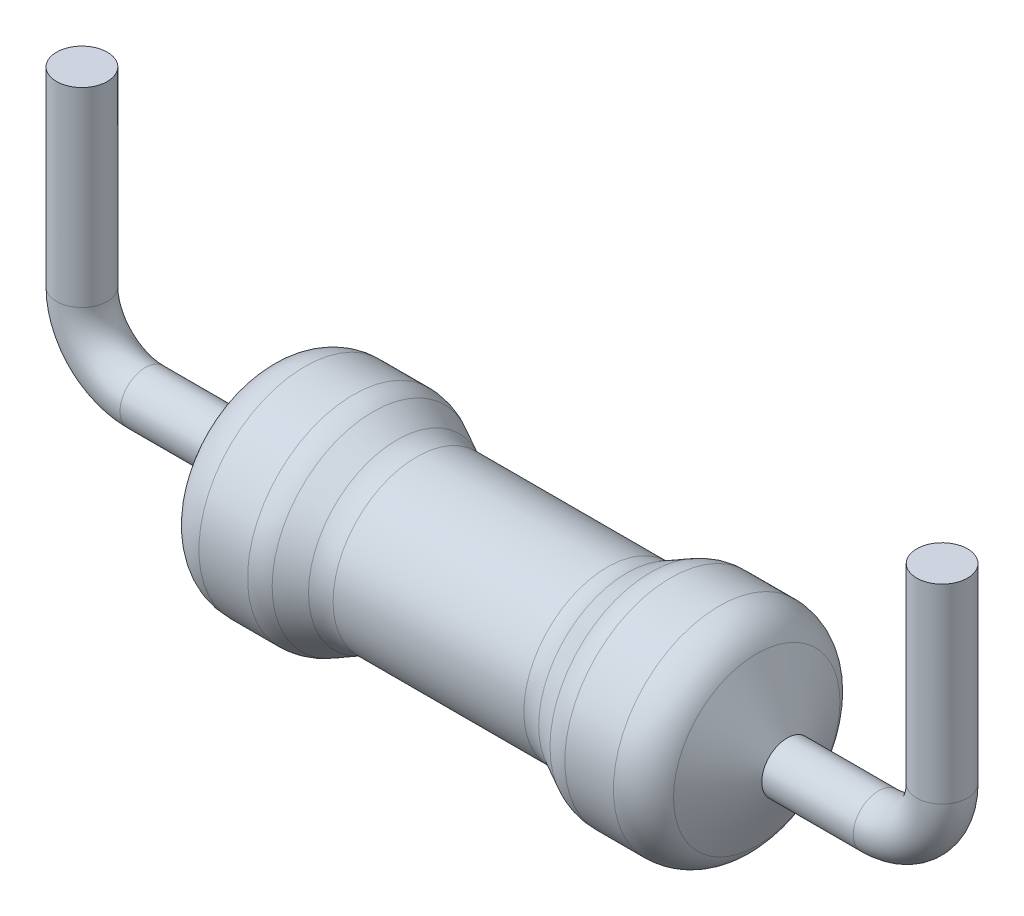
ISO-10303-21;
HEADER;
FILE_DESCRIPTION(('STEP AP214'),'2;1');
FILE_NAME('part.step','',(''),(''),'','','');
FILE_SCHEMA(('AUTOMOTIVE_DESIGN { 1 0 10303 214 1 1 1 1 }'));
ENDSEC;
DATA;
#1=APPLICATION_CONTEXT('core data for automotive mechanical design processes');
#2=APPLICATION_PROTOCOL_DEFINITION('international standard','automotive_design',2000,#1);
#3=PRODUCT_CONTEXT('',#1,'mechanical');
#4=PRODUCT('Part','Part','',(#3));
#5=PRODUCT_RELATED_PRODUCT_CATEGORY('part','',(#4));
#6=PRODUCT_DEFINITION_FORMATION('','',#4);
#7=PRODUCT_DEFINITION_CONTEXT('part definition',#1,'design');
#8=PRODUCT_DEFINITION('design','',#6,#7);
#9=PRODUCT_DEFINITION_SHAPE('','',#8);
#10=(LENGTH_UNIT() NAMED_UNIT(*) SI_UNIT(.MILLI.,.METRE.));
#11=(NAMED_UNIT(*) PLANE_ANGLE_UNIT() SI_UNIT($,.RADIAN.));
#12=(NAMED_UNIT(*) SI_UNIT($,.STERADIAN.) SOLID_ANGLE_UNIT());
#13=UNCERTAINTY_MEASURE_WITH_UNIT(LENGTH_MEASURE(1.E-05),#10,'distance_accuracy_value','');
#14=(GEOMETRIC_REPRESENTATION_CONTEXT(3) GLOBAL_UNCERTAINTY_ASSIGNED_CONTEXT((#13)) GLOBAL_UNIT_ASSIGNED_CONTEXT((#10,
#11,#12)) REPRESENTATION_CONTEXT('',''));
#15=CARTESIAN_POINT('',(0.,0.,0.));
#16=DIRECTION('',(0.,0.,1.));
#17=DIRECTION('',(1.,0.,0.));
#18=AXIS2_PLACEMENT_3D('',#15,#16,#17);
#19=CARTESIAN_POINT('',(3.25,0.,0.));
#20=DIRECTION('',(-1.,0.,0.));
#21=DIRECTION('',(0.,0.,1.));
#22=AXIS2_PLACEMENT_3D('',#19,#20,#21);
#23=CONICAL_SURFACE('',#22,0.3,1.08631839775787);
#24=CARTESIAN_POINT('',(2.89059304399141,0.,0.));
#25=DIRECTION('',(1.,0.,0.));
#26=DIRECTION('',(0.,0.,-1.));
#27=AXIS2_PLACEMENT_3D('',#24,#25,#26);
#28=CIRCLE('',#27,0.982873216416311);
#29=CARTESIAN_POINT('',(2.89059304399141,0.,0.982873216416312));
#30=VERTEX_POINT('',#29);
#31=EDGE_CURVE('E11',#30,#30,#28,.T.);
#32=CARTESIAN_POINT('',(3.25,0.,0.));
#33=DIRECTION('',(-1.,0.,0.));
#34=DIRECTION('',(0.,0.,1.));
#35=AXIS2_PLACEMENT_3D('',#32,#33,#34);
#36=CIRCLE('',#35,0.3);
#37=CARTESIAN_POINT('',(3.25,0.,0.3));
#38=VERTEX_POINT('',#37);
#39=EDGE_CURVE('E61',#38,#38,#36,.T.);
#40=CARTESIAN_POINT('',(2.89059304399141,0.,0.982873216416312));
#41=CARTESIAN_POINT('',(2.89433686644984,0.,0.975759953745308));
#42=CARTESIAN_POINT('',(2.89808068890826,0.,0.968646691074305));
#43=CARTESIAN_POINT('',(2.90556833382511,0.,0.954420165732298));
#44=CARTESIAN_POINT('',(2.90931215628353,0.,0.947306903061295));
#45=CARTESIAN_POINT('',(2.91679980120037,0.,0.933080377719289));
#46=CARTESIAN_POINT('',(2.9205436236588,0.,0.925967115048286));
#47=CARTESIAN_POINT('',(2.92803126857564,0.,0.911740589706279));
#48=CARTESIAN_POINT('',(2.93177509103407,0.,0.904627327035276));
#49=CARTESIAN_POINT('',(2.93926273595091,0.,0.890400801693269));
#50=CARTESIAN_POINT('',(2.94300655840933,0.,0.883287539022266));
#51=CARTESIAN_POINT('',(2.95049420332618,0.,0.869061013680259));
#52=CARTESIAN_POINT('',(2.9542380257846,0.,0.861947751009256));
#53=CARTESIAN_POINT('',(2.96172567070145,0.,0.84772122566725));
#54=CARTESIAN_POINT('',(2.96546949315987,0.,0.840607962996247));
#55=CARTESIAN_POINT('',(2.97295713807672,0.,0.82638143765424));
#56=CARTESIAN_POINT('',(2.97670096053514,0.,0.819268174983237));
#57=CARTESIAN_POINT('',(2.98418860545198,0.,0.80504164964123));
#58=CARTESIAN_POINT('',(2.98793242791041,0.,0.797928386970227));
#59=CARTESIAN_POINT('',(2.99542007282725,0.,0.783701861628221));
#60=CARTESIAN_POINT('',(2.99916389528568,0.,0.776588598957217));
#61=CARTESIAN_POINT('',(3.00665154020252,0.,0.762362073615211));
#62=CARTESIAN_POINT('',(3.01039536266094,0.,0.755248810944208));
#63=CARTESIAN_POINT('',(3.01788300757779,0.,0.741022285602201));
#64=CARTESIAN_POINT('',(3.02162683003621,0.,0.733909022931198));
#65=CARTESIAN_POINT('',(3.02911447495306,0.,0.719682497589191));
#66=CARTESIAN_POINT('',(3.03285829741148,0.,0.712569234918188));
#67=CARTESIAN_POINT('',(3.04034594232833,0.,0.698342709576182));
#68=CARTESIAN_POINT('',(3.04408976478675,0.,0.691229446905178));
#69=CARTESIAN_POINT('',(3.05157740970359,0.,0.677002921563172));
#70=CARTESIAN_POINT('',(3.05532123216202,0.,0.669889658892168));
#71=CARTESIAN_POINT('',(3.06280887707886,0.,0.655663133550162));
#72=CARTESIAN_POINT('',(3.06655269953728,0.,0.648549870879159));
#73=CARTESIAN_POINT('',(3.07404034445413,0.,0.634323345537152));
#74=CARTESIAN_POINT('',(3.07778416691255,0.,0.627210082866149));
#75=CARTESIAN_POINT('',(3.0852718118294,0.,0.612983557524142));
#76=CARTESIAN_POINT('',(3.08901563428782,0.,0.605870294853139));
#77=CARTESIAN_POINT('',(3.09650327920467,0.,0.591643769511133));
#78=CARTESIAN_POINT('',(3.10024710166309,0.,0.58453050684013));
#79=CARTESIAN_POINT('',(3.10773474657993,0.,0.570303981498123));
#80=CARTESIAN_POINT('',(3.11147856903836,0.,0.56319071882712));
#81=CARTESIAN_POINT('',(3.1189662139552,0.,0.548964193485113));
#82=CARTESIAN_POINT('',(3.12271003641363,0.,0.54185093081411));
#83=CARTESIAN_POINT('',(3.13019768133047,0.,0.527624405472104));
#84=CARTESIAN_POINT('',(3.13394150378889,0.,0.5205111428011));
#85=CARTESIAN_POINT('',(3.14142914870574,0.,0.506284617459094));
#86=CARTESIAN_POINT('',(3.14517297116416,0.,0.49917135478809));
#87=CARTESIAN_POINT('',(3.15266061608101,0.,0.484944829446084));
#88=CARTESIAN_POINT('',(3.15640443853943,0.,0.477831566775081));
#89=CARTESIAN_POINT('',(3.16389208345628,0.,0.463605041433074));
#90=CARTESIAN_POINT('',(3.1676359059147,0.,0.456491778762071));
#91=CARTESIAN_POINT('',(3.17512355083154,0.,0.442265253420065));
#92=CARTESIAN_POINT('',(3.17886737328997,0.,0.435151990749061));
#93=CARTESIAN_POINT('',(3.18635501820681,0.,0.420925465407055));
#94=CARTESIAN_POINT('',(3.19009884066524,0.,0.413812202736052));
#95=CARTESIAN_POINT('',(3.19758648558208,0.,0.399585677394045));
#96=CARTESIAN_POINT('',(3.2013303080405,0.,0.392472414723042));
#97=CARTESIAN_POINT('',(3.20881795295735,0.,0.378245889381035));
#98=CARTESIAN_POINT('',(3.21256177541577,0.,0.371132626710032));
#99=CARTESIAN_POINT('',(3.22004942033262,0.,0.356906101368026));
#100=CARTESIAN_POINT('',(3.22379324279104,0.,0.349792838697022));
#101=CARTESIAN_POINT('',(3.23128088770789,0.,0.335566313355016));
#102=CARTESIAN_POINT('',(3.23502471016631,0.,0.328453050684013));
#103=CARTESIAN_POINT('',(3.24251235508315,0.,0.314226525342006));
#104=CARTESIAN_POINT('',(3.24625617754158,0.,0.307113262671003));
#105=CARTESIAN_POINT('',(3.25,0.,0.3));
#106=B_SPLINE_CURVE_WITH_KNOTS('',3,(#40,#41,#42,#43,#44,#45,#46,#47,#48,#49,#50,#51,#52,#53,
#54,#55,#56,#57,#58,#59,#60,#61,#62,#63,#64,#65,#66,#67,#68,#69,#70,#71,#72,#73,#74,#75,#76,#77,
#78,#79,#80,#81,#82,#83,#84,#85,#86,#87,#88,#89,#90,#91,#92,#93,#94,#95,#96,#97,#98,#99,#100,
#101,#102,#103,#104,#105),.UNSPECIFIED.,.F.,.F.,(4,2,2,2,2,2,2,2,2,2,2,2,2,2,2,2,2,2,2,2,2,2,2,
2,2,2,2,2,2,2,2,2,4),(0.,0.024114983139988,0.0482299662799762,0.0723449494199642,
0.0964599325599524,0.12057491569994,0.144689898839929,0.168804881979917,0.192919865119905,
0.217034848259893,0.241149831399881,0.265264814539869,0.289379797679857,0.313494780819845,
0.337609763959833,0.361724747099821,0.385839730239809,0.409954713379797,0.434069696519786,
0.458184679659774,0.482299662799762,0.50641464593975,0.530529629079738,0.554644612219726,
0.578759595359714,0.602874578499702,0.62698956163969,0.651104544779678,0.675219527919667,
0.699334511059655,0.723449494199643,0.747564477339631,0.771679460479619),.UNSPECIFIED.);
#107=EDGE_CURVE('BSEAM39',#30,#38,#106,.T.);
#108=ORIENTED_EDGE('',*,*,#31,.T.);
#109=ORIENTED_EDGE('',*,*,#39,.T.);
#110=ORIENTED_EDGE('',*,*,#107,.T.);
#111=ORIENTED_EDGE('',*,*,#107,.F.);
#112=EDGE_LOOP('',(#108,#110,#109,#111));
#113=FACE_BOUND('',#112,.T.);
#114=ADVANCED_FACE('F39',(#113),#23,.T.);
#115=CARTESIAN_POINT('',(0.,0.,0.));
#116=DIRECTION('',(-1.,0.,0.));
#117=DIRECTION('',(0.,0.,1.));
#118=AXIS2_PLACEMENT_3D('',#115,#116,#117);
#119=CYLINDRICAL_SURFACE('',#118,1.25);
#120=CARTESIAN_POINT('',(1.87354552767919,0.,0.));
#121=DIRECTION('',(1.,0.,0.));
#122=DIRECTION('',(0.,0.,-1.));
#123=AXIS2_PLACEMENT_3D('',#120,#121,#122);
#124=CIRCLE('',#123,1.25);
#125=CARTESIAN_POINT('',(1.87354552767919,0.,-1.25));
#126=VERTEX_POINT('',#125);
#127=EDGE_CURVE('E48',#126,#126,#124,.T.);
#128=ORIENTED_EDGE('',*,*,#127,.T.);
#129=EDGE_LOOP('',(#128));
#130=FACE_BOUND('',#129,.T.);
#131=CARTESIAN_POINT('',(2.44813393280042,0.,0.));
#132=DIRECTION('',(1.,0.,0.));
#133=DIRECTION('',(0.,0.,-1.));
#134=AXIS2_PLACEMENT_3D('',#131,#132,#133);
#135=CIRCLE('',#134,1.25);
#136=CARTESIAN_POINT('',(2.44813393280042,0.,-1.25));
#137=VERTEX_POINT('',#136);
#138=EDGE_CURVE('E113',#137,#137,#135,.F.);
#139=ORIENTED_EDGE('',*,*,#138,.T.);
#140=EDGE_LOOP('',(#139));
#141=FACE_BOUND('',#140,.T.);
#142=ADVANCED_FACE('F120',(#130,#141),#119,.T.);
#143=CARTESIAN_POINT('',(1.75,0.,0.));
#144=DIRECTION('',(1.,0.,0.));
#145=DIRECTION('',(0.,0.,-1.));
#146=AXIS2_PLACEMENT_3D('',#143,#144,#145);
#147=CONICAL_SURFACE('',#146,1.25,0.484477929037023);
#148=CARTESIAN_POINT('',(1.35932768873712,0.,0.));
#149=DIRECTION('',(1.,0.,0.));
#150=DIRECTION('',(0.,0.,-1.));
#151=AXIS2_PLACEMENT_3D('',#148,#149,#150);
#152=CIRCLE('',#151,1.04438299407217);
#153=CARTESIAN_POINT('',(1.35932768873712,0.,-1.04438299407217));
#154=VERTEX_POINT('',#153);
#155=EDGE_CURVE('E109',#154,#154,#152,.T.);
#156=ORIENTED_EDGE('',*,*,#155,.T.);
#157=EDGE_LOOP('',(#156));
#158=FACE_BOUND('',#157,.T.);
#159=CARTESIAN_POINT('',(1.64067231126288,0.,0.));
#160=DIRECTION('',(-1.,0.,0.));
#161=DIRECTION('',(0.,0.,1.));
#162=AXIS2_PLACEMENT_3D('',#159,#160,#161);
#163=CIRCLE('',#162,1.19245911119099);
#164=CARTESIAN_POINT('',(1.64067231126288,0.,1.19245911119099));
#165=VERTEX_POINT('',#164);
#166=EDGE_CURVE('E105',#165,#165,#163,.T.);
#167=ORIENTED_EDGE('',*,*,#166,.T.);
#168=EDGE_LOOP('',(#167));
#169=FACE_BOUND('',#168,.T.);
#170=ADVANCED_FACE('F129',(#158,#169),#147,.T.);
#171=CARTESIAN_POINT('',(0.,0.,0.));
#172=DIRECTION('',(-1.,0.,0.));
#173=DIRECTION('',(0.,0.,1.));
#174=AXIS2_PLACEMENT_3D('',#171,#172,#173);
#175=CYLINDRICAL_SURFACE('',#174,0.986842105263158);
#176=CARTESIAN_POINT('',(-1.12645447232081,0.,0.));
#177=DIRECTION('',(-1.,0.,0.));
#178=DIRECTION('',(0.,0.,1.));
#179=AXIS2_PLACEMENT_3D('',#176,#177,#178);
#180=CIRCLE('',#179,0.986842105263158);
#181=CARTESIAN_POINT('',(-1.12645447232081,0.,0.986842105263158));
#182=VERTEX_POINT('',#181);
#183=EDGE_CURVE('E101',#182,#182,#180,.F.);
#184=ORIENTED_EDGE('',*,*,#183,.T.);
#185=EDGE_LOOP('',(#184));
#186=FACE_BOUND('',#185,.T.);
#187=CARTESIAN_POINT('',(1.12645447232081,0.,0.));
#188=DIRECTION('',(-1.,0.,0.));
#189=DIRECTION('',(0.,0.,1.));
#190=AXIS2_PLACEMENT_3D('',#187,#188,#189);
#191=CIRCLE('',#190,0.986842105263158);
#192=CARTESIAN_POINT('',(1.12645447232081,0.,0.986842105263158));
#193=VERTEX_POINT('',#192);
#194=EDGE_CURVE('E97',#193,#193,#191,.T.);
#195=ORIENTED_EDGE('',*,*,#194,.T.);
#196=EDGE_LOOP('',(#195));
#197=FACE_BOUND('',#196,.T.);
#198=ADVANCED_FACE('F131',(#186,#197),#175,.T.);
#199=CARTESIAN_POINT('',(-1.25,0.,0.));
#200=DIRECTION('',(-1.,0.,0.));
#201=DIRECTION('',(0.,0.,1.));
#202=AXIS2_PLACEMENT_3D('',#199,#200,#201);
#203=CONICAL_SURFACE('',#202,0.986842105263158,0.484477929037023);
#204=CARTESIAN_POINT('',(-1.64067231126288,0.,0.));
#205=DIRECTION('',(1.,0.,0.));
#206=DIRECTION('',(0.,0.,-1.));
#207=AXIS2_PLACEMENT_3D('',#204,#205,#206);
#208=CIRCLE('',#207,1.19245911119099);
#209=CARTESIAN_POINT('',(-1.64067231126288,0.,-1.19245911119099));
#210=VERTEX_POINT('',#209);
#211=EDGE_CURVE('E93',#210,#210,#208,.T.);
#212=ORIENTED_EDGE('',*,*,#211,.T.);
#213=EDGE_LOOP('',(#212));
#214=FACE_BOUND('',#213,.T.);
#215=CARTESIAN_POINT('',(-1.35932768873712,0.,0.));
#216=DIRECTION('',(-1.,0.,0.));
#217=DIRECTION('',(0.,0.,1.));
#218=AXIS2_PLACEMENT_3D('',#215,#216,#217);
#219=CIRCLE('',#218,1.04438299407217);
#220=CARTESIAN_POINT('',(-1.35932768873712,0.,1.04438299407217));
#221=VERTEX_POINT('',#220);
#222=EDGE_CURVE('E89',#221,#221,#219,.T.);
#223=ORIENTED_EDGE('',*,*,#222,.T.);
#224=EDGE_LOOP('',(#223));
#225=FACE_BOUND('',#224,.T.);
#226=ADVANCED_FACE('F138',(#214,#225),#203,.T.);
#227=CARTESIAN_POINT('',(0.,0.,0.));
#228=DIRECTION('',(-1.,0.,0.));
#229=DIRECTION('',(0.,0.,1.));
#230=AXIS2_PLACEMENT_3D('',#227,#228,#229);
#231=CYLINDRICAL_SURFACE('',#230,1.25);
#232=CARTESIAN_POINT('',(-2.44813393280042,0.,0.));
#233=DIRECTION('',(1.,0.,0.));
#234=DIRECTION('',(0.,0.,-1.));
#235=AXIS2_PLACEMENT_3D('',#232,#233,#234);
#236=CIRCLE('',#235,1.25);
#237=CARTESIAN_POINT('',(-2.44813393280042,0.,-1.25));
#238=VERTEX_POINT('',#237);
#239=EDGE_CURVE('E85',#238,#238,#236,.T.);
#240=ORIENTED_EDGE('',*,*,#239,.T.);
#241=EDGE_LOOP('',(#240));
#242=FACE_BOUND('',#241,.T.);
#243=CARTESIAN_POINT('',(-1.87354552767919,0.,0.));
#244=DIRECTION('',(1.,0.,0.));
#245=DIRECTION('',(0.,0.,-1.));
#246=AXIS2_PLACEMENT_3D('',#243,#244,#245);
#247=CIRCLE('',#246,1.25);
#248=CARTESIAN_POINT('',(-1.87354552767919,0.,-1.25));
#249=VERTEX_POINT('',#248);
#250=EDGE_CURVE('E81',#249,#249,#247,.F.);
#251=ORIENTED_EDGE('',*,*,#250,.T.);
#252=EDGE_LOOP('',(#251));
#253=FACE_BOUND('',#252,.T.);
#254=ADVANCED_FACE('F285',(#242,#253),#231,.T.);
#255=CARTESIAN_POINT('',(-2.75,0.,0.));
#256=DIRECTION('',(1.,0.,0.));
#257=DIRECTION('',(0.,0.,-1.));
#258=AXIS2_PLACEMENT_3D('',#255,#256,#257);
#259=CONICAL_SURFACE('',#258,1.25,1.08631839775787);
#260=CARTESIAN_POINT('',(-2.89059304399141,0.,0.));
#261=DIRECTION('',(-1.,0.,0.));
#262=DIRECTION('',(0.,0.,1.));
#263=AXIS2_PLACEMENT_3D('',#260,#261,#262);
#264=CIRCLE('',#263,0.982873216416311);
#265=CARTESIAN_POINT('',(-2.89059304399141,0.,-0.982873216416312));
#266=VERTEX_POINT('',#265);
#267=EDGE_CURVE('E77',#266,#266,#264,.T.);
#268=CARTESIAN_POINT('',(-3.25,0.,0.));
#269=DIRECTION('',(-1.,0.,0.));
#270=DIRECTION('',(0.,0.,1.));
#271=AXIS2_PLACEMENT_3D('',#268,#269,#270);
#272=CIRCLE('',#271,0.3);
#273=CARTESIAN_POINT('',(-3.25,0.,-0.3));
#274=VERTEX_POINT('',#273);
#275=EDGE_CURVE('E67',#274,#274,#272,.T.);
#276=CARTESIAN_POINT('',(-2.89059304399141,0.,-0.982873216416312));
#277=CARTESIAN_POINT('',(-2.89433686644984,0.,-0.975759953745309));
#278=CARTESIAN_POINT('',(-2.89808068890826,0.,-0.968646691074305));
#279=CARTESIAN_POINT('',(-2.90556833382511,0.,-0.954420165732299));
#280=CARTESIAN_POINT('',(-2.90931215628353,0.,-0.947306903061295));
#281=CARTESIAN_POINT('',(-2.91679980120037,0.,-0.933080377719289));
#282=CARTESIAN_POINT('',(-2.9205436236588,0.,-0.925967115048286));
#283=CARTESIAN_POINT('',(-2.92803126857564,0.,-0.911740589706279));
#284=CARTESIAN_POINT('',(-2.93177509103407,0.,-0.904627327035276));
#285=CARTESIAN_POINT('',(-2.93926273595091,0.,-0.890400801693269));
#286=CARTESIAN_POINT('',(-2.94300655840933,0.,-0.883287539022266));
#287=CARTESIAN_POINT('',(-2.95049420332618,0.,-0.86906101368026));
#288=CARTESIAN_POINT('',(-2.9542380257846,0.,-0.861947751009256));
#289=CARTESIAN_POINT('',(-2.96172567070145,0.,-0.84772122566725));
#290=CARTESIAN_POINT('',(-2.96546949315987,0.,-0.840607962996247));
#291=CARTESIAN_POINT('',(-2.97295713807672,0.,-0.82638143765424));
#292=CARTESIAN_POINT('',(-2.97670096053514,0.,-0.819268174983237));
#293=CARTESIAN_POINT('',(-2.98418860545198,0.,-0.805041649641231));
#294=CARTESIAN_POINT('',(-2.98793242791041,0.,-0.797928386970227));
#295=CARTESIAN_POINT('',(-2.99542007282725,0.,-0.783701861628221));
#296=CARTESIAN_POINT('',(-2.99916389528568,0.,-0.776588598957218));
#297=CARTESIAN_POINT('',(-3.00665154020252,0.,-0.762362073615211));
#298=CARTESIAN_POINT('',(-3.01039536266094,0.,-0.755248810944208));
#299=CARTESIAN_POINT('',(-3.01788300757779,0.,-0.741022285602201));
#300=CARTESIAN_POINT('',(-3.02162683003621,0.,-0.733909022931198));
#301=CARTESIAN_POINT('',(-3.02911447495306,0.,-0.719682497589192));
#302=CARTESIAN_POINT('',(-3.03285829741148,0.,-0.712569234918188));
#303=CARTESIAN_POINT('',(-3.04034594232833,0.,-0.698342709576182));
#304=CARTESIAN_POINT('',(-3.04408976478675,0.,-0.691229446905179));
#305=CARTESIAN_POINT('',(-3.05157740970359,0.,-0.677002921563172));
#306=CARTESIAN_POINT('',(-3.05532123216202,0.,-0.669889658892169));
#307=CARTESIAN_POINT('',(-3.06280887707886,0.,-0.655663133550162));
#308=CARTESIAN_POINT('',(-3.06655269953728,0.,-0.648549870879159));
#309=CARTESIAN_POINT('',(-3.07404034445413,0.,-0.634323345537153));
#310=CARTESIAN_POINT('',(-3.07778416691255,0.,-0.627210082866149));
#311=CARTESIAN_POINT('',(-3.0852718118294,0.,-0.612983557524143));
#312=CARTESIAN_POINT('',(-3.08901563428782,0.,-0.60587029485314));
#313=CARTESIAN_POINT('',(-3.09650327920467,0.,-0.591643769511133));
#314=CARTESIAN_POINT('',(-3.10024710166309,0.,-0.58453050684013));
#315=CARTESIAN_POINT('',(-3.10773474657993,0.,-0.570303981498123));
#316=CARTESIAN_POINT('',(-3.11147856903836,0.,-0.56319071882712));
#317=CARTESIAN_POINT('',(-3.1189662139552,0.,-0.548964193485114));
#318=CARTESIAN_POINT('',(-3.12271003641363,0.,-0.54185093081411));
#319=CARTESIAN_POINT('',(-3.13019768133047,0.,-0.527624405472104));
#320=CARTESIAN_POINT('',(-3.13394150378889,0.,-0.520511142801101));
#321=CARTESIAN_POINT('',(-3.14142914870574,0.,-0.506284617459094));
#322=CARTESIAN_POINT('',(-3.14517297116416,0.,-0.499171354788091));
#323=CARTESIAN_POINT('',(-3.15266061608101,0.,-0.484944829446084));
#324=CARTESIAN_POINT('',(-3.15640443853943,0.,-0.477831566775081));
#325=CARTESIAN_POINT('',(-3.16389208345628,0.,-0.463605041433075));
#326=CARTESIAN_POINT('',(-3.1676359059147,0.,-0.456491778762072));
#327=CARTESIAN_POINT('',(-3.17512355083154,0.,-0.442265253420065));
#328=CARTESIAN_POINT('',(-3.17886737328997,0.,-0.435151990749062));
#329=CARTESIAN_POINT('',(-3.18635501820681,0.,-0.420925465407055));
#330=CARTESIAN_POINT('',(-3.19009884066524,0.,-0.413812202736052));
#331=CARTESIAN_POINT('',(-3.19758648558208,0.,-0.399585677394046));
#332=CARTESIAN_POINT('',(-3.2013303080405,0.,-0.392472414723042));
#333=CARTESIAN_POINT('',(-3.20881795295735,0.,-0.378245889381036));
#334=CARTESIAN_POINT('',(-3.21256177541577,0.,-0.371132626710033));
#335=CARTESIAN_POINT('',(-3.22004942033262,0.,-0.356906101368026));
#336=CARTESIAN_POINT('',(-3.22379324279104,0.,-0.349792838697023));
#337=CARTESIAN_POINT('',(-3.23128088770789,0.,-0.335566313355016));
#338=CARTESIAN_POINT('',(-3.23502471016631,0.,-0.328453050684013));
#339=CARTESIAN_POINT('',(-3.24251235508315,0.,-0.314226525342007));
#340=CARTESIAN_POINT('',(-3.24625617754158,0.,-0.307113262671003));
#341=CARTESIAN_POINT('',(-3.25,0.,-0.3));
#342=B_SPLINE_CURVE_WITH_KNOTS('',3,(#276,#277,#278,#279,#280,#281,#282,#283,#284,#285,#286,
#287,#288,#289,#290,#291,#292,#293,#294,#295,#296,#297,#298,#299,#300,#301,#302,#303,#304,#305,
#306,#307,#308,#309,#310,#311,#312,#313,#314,#315,#316,#317,#318,#319,#320,#321,#322,#323,#324,
#325,#326,#327,#328,#329,#330,#331,#332,#333,#334,#335,#336,#337,#338,#339,#340,#341),
.UNSPECIFIED.,.F.,.F.,(4,2,2,2,2,2,2,2,2,2,2,2,2,2,2,2,2,2,2,2,2,2,2,2,2,2,2,2,2,2,2,2,4),(0.,
0.0241149831399881,0.0482299662799762,0.0723449494199643,0.0964599325599524,0.12057491569994,
0.144689898839929,0.168804881979917,0.192919865119905,0.217034848259893,0.241149831399881,
0.265264814539869,0.289379797679857,0.313494780819845,0.337609763959833,0.361724747099821,
0.385839730239809,0.409954713379797,0.434069696519785,0.458184679659774,0.482299662799762,
0.50641464593975,0.530529629079738,0.554644612219726,0.578759595359714,0.602874578499702,
0.62698956163969,0.651104544779678,0.675219527919667,0.699334511059655,0.723449494199643,
0.747564477339631,0.771679460479619),.UNSPECIFIED.);
#343=EDGE_CURVE('BSEAM153',#266,#274,#342,.T.);
#344=ORIENTED_EDGE('',*,*,#267,.T.);
#345=ORIENTED_EDGE('',*,*,#275,.F.);
#346=ORIENTED_EDGE('',*,*,#343,.T.);
#347=ORIENTED_EDGE('',*,*,#343,.F.);
#348=EDGE_LOOP('',(#344,#346,#345,#347));
#349=FACE_BOUND('',#348,.T.);
#350=ADVANCED_FACE('F153',(#349),#259,.T.);
#351=CARTESIAN_POINT('',(-2.44813393280042,0.,0.));
#352=DIRECTION('',(1.,0.,0.));
#353=DIRECTION('',(0.,0.,-1.));
#354=AXIS2_PLACEMENT_3D('',#351,#352,#353);
#355=TOROIDAL_SURFACE('',#354,0.75,0.5);
#356=ORIENTED_EDGE('',*,*,#239,.F.);
#357=EDGE_LOOP('',(#356));
#358=FACE_BOUND('',#357,.T.);
#359=ORIENTED_EDGE('',*,*,#267,.F.);
#360=EDGE_LOOP('',(#359));
#361=FACE_BOUND('',#360,.T.);
#362=ADVANCED_FACE('F149',(#358,#361),#355,.T.);
#363=CARTESIAN_POINT('',(-1.87354552767919,0.,0.));
#364=DIRECTION('',(1.,0.,0.));
#365=DIRECTION('',(0.,0.,-1.));
#366=AXIS2_PLACEMENT_3D('',#363,#364,#365);
#367=TOROIDAL_SURFACE('',#366,0.75,0.5);
#368=ORIENTED_EDGE('',*,*,#211,.F.);
#369=EDGE_LOOP('',(#368));
#370=FACE_BOUND('',#369,.T.);
#371=ORIENTED_EDGE('',*,*,#250,.F.);
#372=EDGE_LOOP('',(#371));
#373=FACE_BOUND('',#372,.T.);
#374=ADVANCED_FACE('F152',(#370,#373),#367,.T.);
#375=CARTESIAN_POINT('',(-1.12645447232081,0.,0.));
#376=DIRECTION('',(-1.,0.,0.));
#377=DIRECTION('',(0.,0.,1.));
#378=AXIS2_PLACEMENT_3D('',#375,#376,#377);
#379=TOROIDAL_SURFACE('',#378,1.48684210526316,0.5);
#380=ORIENTED_EDGE('',*,*,#183,.F.);
#381=EDGE_LOOP('',(#380));
#382=FACE_BOUND('',#381,.T.);
#383=ORIENTED_EDGE('',*,*,#222,.F.);
#384=EDGE_LOOP('',(#383));
#385=FACE_BOUND('',#384,.T.);
#386=ADVANCED_FACE('F157',(#382,#385),#379,.F.);
#387=CARTESIAN_POINT('',(1.12645447232081,0.,0.));
#388=DIRECTION('',(-1.,0.,0.));
#389=DIRECTION('',(0.,0.,1.));
#390=AXIS2_PLACEMENT_3D('',#387,#388,#389);
#391=TOROIDAL_SURFACE('',#390,1.48684210526316,0.5);
#392=ORIENTED_EDGE('',*,*,#155,.F.);
#393=EDGE_LOOP('',(#392));
#394=FACE_BOUND('',#393,.T.);
#395=ORIENTED_EDGE('',*,*,#194,.F.);
#396=EDGE_LOOP('',(#395));
#397=FACE_BOUND('',#396,.T.);
#398=ADVANCED_FACE('F126',(#394,#397),#391,.F.);
#399=CARTESIAN_POINT('',(1.87354552767919,0.,0.));
#400=DIRECTION('',(1.,0.,0.));
#401=DIRECTION('',(0.,0.,-1.));
#402=AXIS2_PLACEMENT_3D('',#399,#400,#401);
#403=TOROIDAL_SURFACE('',#402,0.75,0.5);
#404=ORIENTED_EDGE('',*,*,#127,.F.);
#405=EDGE_LOOP('',(#404));
#406=FACE_BOUND('',#405,.T.);
#407=ORIENTED_EDGE('',*,*,#166,.F.);
#408=EDGE_LOOP('',(#407));
#409=FACE_BOUND('',#408,.T.);
#410=ADVANCED_FACE('F123',(#406,#409),#403,.T.);
#411=CARTESIAN_POINT('',(2.44813393280042,0.,0.));
#412=DIRECTION('',(1.,0.,0.));
#413=DIRECTION('',(0.,0.,-1.));
#414=AXIS2_PLACEMENT_3D('',#411,#412,#413);
#415=TOROIDAL_SURFACE('',#414,0.75,0.5);
#416=ORIENTED_EDGE('',*,*,#31,.F.);
#417=EDGE_LOOP('',(#416));
#418=FACE_BOUND('',#417,.T.);
#419=ORIENTED_EDGE('',*,*,#138,.F.);
#420=EDGE_LOOP('',(#419));
#421=FACE_BOUND('',#420,.T.);
#422=ADVANCED_FACE('F41',(#418,#421),#415,.T.);
#423=CARTESIAN_POINT('',(-5.08,3.,0.));
#424=DIRECTION('',(0.,-1.,0.));
#425=DIRECTION('',(0.,0.,-1.));
#426=AXIS2_PLACEMENT_3D('',#423,#424,#425);
#427=PLANE('',#426);
#428=CARTESIAN_POINT('',(-5.08,3.,0.));
#429=DIRECTION('',(0.,-1.,0.));
#430=DIRECTION('',(0.,0.,-1.));
#431=AXIS2_PLACEMENT_3D('',#428,#429,#430);
#432=CIRCLE('',#431,0.3);
#433=CARTESIAN_POINT('',(-5.08,3.,-0.3));
#434=VERTEX_POINT('',#433);
#435=EDGE_CURVE('E53',#434,#434,#432,.T.);
#436=ORIENTED_EDGE('',*,*,#435,.F.);
#437=EDGE_LOOP('',(#436));
#438=FACE_BOUND('',#437,.T.);
#439=ADVANCED_FACE('F182',(#438),#427,.F.);
#440=CARTESIAN_POINT('',(-5.08,3.,0.));
#441=DIRECTION('',(0.,-1.,0.));
#442=DIRECTION('',(0.,0.,-1.));
#443=AXIS2_PLACEMENT_3D('',#440,#441,#442);
#444=CYLINDRICAL_SURFACE('',#443,0.3);
#445=CARTESIAN_POINT('',(-5.08,0.75,0.));
#446=DIRECTION('',(0.,-1.,0.));
#447=DIRECTION('',(0.,0.,-1.));
#448=AXIS2_PLACEMENT_3D('',#445,#446,#447);
#449=CIRCLE('',#448,0.3);
#450=CARTESIAN_POINT('',(-5.38,0.75,0.));
#451=VERTEX_POINT('',#450);
#452=EDGE_CURVE('E351',#451,#451,#449,.T.);
#453=ORIENTED_EDGE('',*,*,#452,.F.);
#454=EDGE_LOOP('',(#453));
#455=FACE_BOUND('',#454,.T.);
#456=ORIENTED_EDGE('',*,*,#435,.T.);
#457=EDGE_LOOP('',(#456));
#458=FACE_BOUND('',#457,.T.);
#459=ADVANCED_FACE('F189',(#455,#458),#444,.T.);
#460=CARTESIAN_POINT('',(-4.33,0.749999999999999,0.));
#461=DIRECTION('',(0.,0.,1.));
#462=DIRECTION('',(1.,0.,0.));
#463=AXIS2_PLACEMENT_3D('',#460,#461,#462);
#464=TOROIDAL_SURFACE('',#463,0.75,0.3);
#465=CARTESIAN_POINT('',(-4.33,0.,0.));
#466=DIRECTION('',(1.,0.,0.));
#467=DIRECTION('',(0.,0.,-1.));
#468=AXIS2_PLACEMENT_3D('',#465,#466,#467);
#469=CIRCLE('',#468,0.3);
#470=CARTESIAN_POINT('',(-4.33,-0.300000000000001,0.));
#471=VERTEX_POINT('',#470);
#472=EDGE_CURVE('E348',#471,#471,#469,.T.);
#473=CARTESIAN_POINT('',(-4.33,0.749999999999999,0.));
#474=DIRECTION('',(0.,0.,1.));
#475=DIRECTION('',(1.,0.,0.));
#476=AXIS2_PLACEMENT_3D('',#473,#474,#475);
#477=CIRCLE('',#476,1.05);
#478=EDGE_CURVE('',#451,#471,#477,.T.);
#479=ORIENTED_EDGE('',*,*,#452,.T.);
#480=ORIENTED_EDGE('',*,*,#472,.F.);
#481=ORIENTED_EDGE('',*,*,#478,.T.);
#482=ORIENTED_EDGE('',*,*,#478,.F.);
#483=EDGE_LOOP('',(#479,#481,#480,#482));
#484=FACE_BOUND('',#483,.T.);
#485=ADVANCED_FACE('F196',(#484),#464,.T.);
#486=CARTESIAN_POINT('',(-4.33,0.,0.));
#487=DIRECTION('',(1.,0.,0.));
#488=DIRECTION('',(0.,1.,0.));
#489=AXIS2_PLACEMENT_3D('',#486,#487,#488);
#490=CYLINDRICAL_SURFACE('',#489,0.3);
#491=ORIENTED_EDGE('',*,*,#472,.T.);
#492=EDGE_LOOP('',(#491));
#493=FACE_BOUND('',#492,.T.);
#494=ORIENTED_EDGE('',*,*,#275,.T.);
#495=EDGE_LOOP('',(#494));
#496=FACE_BOUND('',#495,.T.);
#497=ADVANCED_FACE('F204',(#493,#496),#490,.T.);
#498=CARTESIAN_POINT('',(4.33,0.,0.));
#499=DIRECTION('',(1.,0.,0.));
#500=DIRECTION('',(0.,0.,-1.));
#501=AXIS2_PLACEMENT_3D('',#498,#499,#500);
#502=CIRCLE('',#501,0.3);
#503=CARTESIAN_POINT('',(4.33,-0.299999999999999,0.));
#504=VERTEX_POINT('',#503);
#505=EDGE_CURVE('E70',#504,#504,#502,.T.);
#506=ORIENTED_EDGE('',*,*,#505,.F.);
#507=EDGE_LOOP('',(#506));
#508=FACE_BOUND('',#507,.T.);
#509=ORIENTED_EDGE('',*,*,#39,.F.);
#510=EDGE_LOOP('',(#509));
#511=FACE_BOUND('',#510,.T.);
#512=ADVANCED_FACE('F212',(#508,#511),#490,.T.);
#513=CARTESIAN_POINT('',(5.08,3.,0.));
#514=DIRECTION('',(0.,1.,0.));
#515=DIRECTION('',(0.,0.,-1.));
#516=AXIS2_PLACEMENT_3D('',#513,#514,#515);
#517=PLANE('',#516);
#518=CARTESIAN_POINT('',(5.08,3.,0.));
#519=DIRECTION('',(0.,1.,0.));
#520=DIRECTION('',(0.,0.,-1.));
#521=AXIS2_PLACEMENT_3D('',#518,#519,#520);
#522=CIRCLE('',#521,0.3);
#523=CARTESIAN_POINT('',(5.08,3.,-0.3));
#524=VERTEX_POINT('',#523);
#525=EDGE_CURVE('E57',#524,#524,#522,.T.);
#526=ORIENTED_EDGE('',*,*,#525,.T.);
#527=EDGE_LOOP('',(#526));
#528=FACE_BOUND('',#527,.T.);
#529=ADVANCED_FACE('F58',(#528),#517,.T.);
#530=CARTESIAN_POINT('',(4.33,0.75,0.));
#531=DIRECTION('',(0.,0.,1.));
#532=DIRECTION('',(1.,0.,0.));
#533=AXIS2_PLACEMENT_3D('',#530,#531,#532);
#534=TOROIDAL_SURFACE('',#533,0.749999999999999,0.3);
#535=CARTESIAN_POINT('',(5.08,0.75,0.));
#536=DIRECTION('',(0.,1.,0.));
#537=DIRECTION('',(0.,0.,-1.));
#538=AXIS2_PLACEMENT_3D('',#535,#536,#537);
#539=CIRCLE('',#538,0.3);
#540=CARTESIAN_POINT('',(5.38,0.75,0.));
#541=VERTEX_POINT('',#540);
#542=EDGE_CURVE('E62',#541,#541,#539,.T.);
#543=CARTESIAN_POINT('',(4.33,0.75,0.));
#544=DIRECTION('',(0.,0.,1.));
#545=DIRECTION('',(1.,0.,0.));
#546=AXIS2_PLACEMENT_3D('',#543,#544,#545);
#547=CIRCLE('',#546,1.05);
#548=EDGE_CURVE('',#504,#541,#547,.T.);
#549=ORIENTED_EDGE('',*,*,#505,.T.);
#550=ORIENTED_EDGE('',*,*,#542,.F.);
#551=ORIENTED_EDGE('',*,*,#548,.T.);
#552=ORIENTED_EDGE('',*,*,#548,.F.);
#553=EDGE_LOOP('',(#549,#551,#550,#552));
#554=FACE_BOUND('',#553,.T.);
#555=ADVANCED_FACE('F227',(#554),#534,.T.);
#556=CARTESIAN_POINT('',(5.08,0.75,0.));
#557=DIRECTION('',(0.,1.,0.));
#558=DIRECTION('',(-1.,0.,0.));
#559=AXIS2_PLACEMENT_3D('',#556,#557,#558);
#560=CYLINDRICAL_SURFACE('',#559,0.3);
#561=ORIENTED_EDGE('',*,*,#525,.F.);
#562=EDGE_LOOP('',(#561));
#563=FACE_BOUND('',#562,.T.);
#564=ORIENTED_EDGE('',*,*,#542,.T.);
#565=EDGE_LOOP('',(#564));
#566=FACE_BOUND('',#565,.T.);
#567=ADVANCED_FACE('F221',(#563,#566),#560,.T.);
#568=CLOSED_SHELL('',(#114,#142,#170,#198,#226,#254,#350,#362,#374,#386,#398,#410,#422,#439,
#459,#485,#497,#512,#529,#555,#567));
#569=MANIFOLD_SOLID_BREP('B2',#568);
#570=ADVANCED_BREP_SHAPE_REPRESENTATION('',(#18,#569),#14);
#571=SHAPE_DEFINITION_REPRESENTATION(#9,#570);
ENDSEC;
END-ISO-10303-21;
